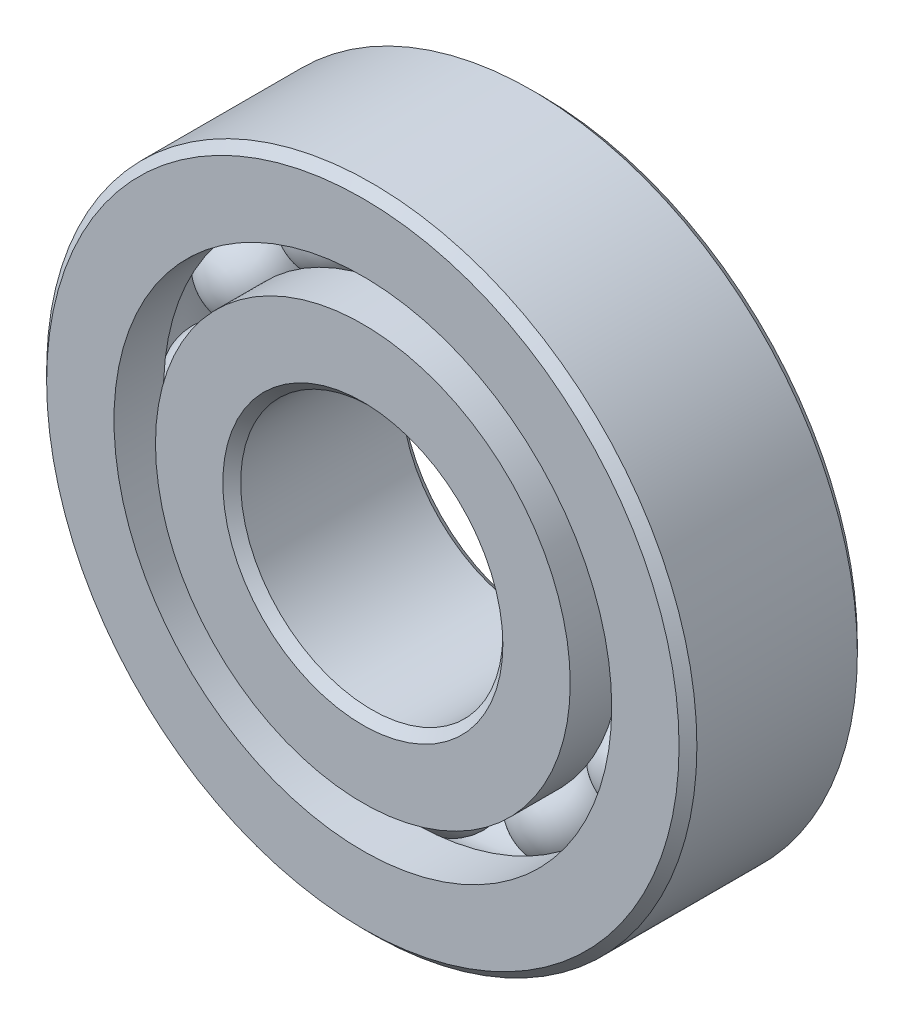
ISO-10303-21;
HEADER;
FILE_DESCRIPTION(('STEP AP214'),'2;1');
FILE_NAME('part.step','',(''),(''),'','','');
FILE_SCHEMA(('AUTOMOTIVE_DESIGN { 1 0 10303 214 1 1 1 1 }'));
ENDSEC;
DATA;
#1=APPLICATION_CONTEXT('core data for automotive mechanical design processes');
#2=APPLICATION_PROTOCOL_DEFINITION('international standard','automotive_design',2000,#1);
#3=PRODUCT_CONTEXT('',#1,'mechanical');
#4=PRODUCT('Part','Part','',(#3));
#5=PRODUCT_RELATED_PRODUCT_CATEGORY('part','',(#4));
#6=PRODUCT_DEFINITION_FORMATION('','',#4);
#7=PRODUCT_DEFINITION_CONTEXT('part definition',#1,'design');
#8=PRODUCT_DEFINITION('design','',#6,#7);
#9=PRODUCT_DEFINITION_SHAPE('','',#8);
#10=(LENGTH_UNIT() NAMED_UNIT(*) SI_UNIT(.MILLI.,.METRE.));
#11=(NAMED_UNIT(*) PLANE_ANGLE_UNIT() SI_UNIT($,.RADIAN.));
#12=(NAMED_UNIT(*) SI_UNIT($,.STERADIAN.) SOLID_ANGLE_UNIT());
#13=UNCERTAINTY_MEASURE_WITH_UNIT(LENGTH_MEASURE(1.E-05),#10,'distance_accuracy_value','');
#14=(GEOMETRIC_REPRESENTATION_CONTEXT(3) GLOBAL_UNCERTAINTY_ASSIGNED_CONTEXT((#13)) GLOBAL_UNIT_ASSIGNED_CONTEXT((#10,
#11,#12)) REPRESENTATION_CONTEXT('',''));
#15=CARTESIAN_POINT('',(0.,0.,0.));
#16=DIRECTION('',(0.,0.,1.));
#17=DIRECTION('',(1.,0.,0.));
#18=AXIS2_PLACEMENT_3D('',#15,#16,#17);
#19=CARTESIAN_POINT('',(-10.8749999999998,18.8360525323117,0.));
#20=DIRECTION('',(0.,0.,1.));
#21=DIRECTION('',(-0.499999999999989,0.866025403784445,0.));
#22=AXIS2_PLACEMENT_3D('',#19,#20,#21);
#23=SPHERICAL_SURFACE('',#22,4.26429078321467);
#24=CARTESIAN_POINT('',(-10.8749999999998,18.8360525323117,4.26429078321467));
#25=VERTEX_POINT('',#24);
#26=VERTEX_LOOP('',#25);
#27=FACE_BOUND('',#26,.T.);
#28=ADVANCED_FACE('F43',(#27),#23,.T.);
#29=CLOSED_SHELL('',(#28));
#30=MANIFOLD_SOLID_BREP('B2',#29);
#31=CARTESIAN_POINT('',(-18.8360525323114,10.8750000000002,0.));
#32=DIRECTION('',(0.,0.,1.));
#33=DIRECTION('',(-0.866025403784433,0.50000000000001,0.));
#34=AXIS2_PLACEMENT_3D('',#31,#32,#33);
#35=SPHERICAL_SURFACE('',#34,4.26429078321467);
#36=CARTESIAN_POINT('',(-18.8360525323114,10.8750000000002,4.26429078321467));
#37=VERTEX_POINT('',#36);
#38=VERTEX_LOOP('',#37);
#39=FACE_BOUND('',#38,.T.);
#40=ADVANCED_FACE('F63',(#39),#35,.T.);
#41=CLOSED_SHELL('',(#40));
#42=MANIFOLD_SOLID_BREP('B6',#41);
#43=CARTESIAN_POINT('',(-21.75,2.27819157359514E-13,0.));
#44=DIRECTION('',(0.,0.,1.));
#45=DIRECTION('',(-1.,0.,0.));
#46=AXIS2_PLACEMENT_3D('',#43,#44,#45);
#47=SPHERICAL_SURFACE('',#46,4.26429078321467);
#48=CARTESIAN_POINT('',(-21.75,2.27819157359514E-13,4.26429078321467));
#49=VERTEX_POINT('',#48);
#50=VERTEX_LOOP('',#49);
#51=FACE_BOUND('',#50,.T.);
#52=ADVANCED_FACE('F83',(#51),#47,.T.);
#53=CLOSED_SHELL('',(#52));
#54=MANIFOLD_SOLID_BREP('B39',#53);
#55=CARTESIAN_POINT('',(-18.8360525323116,-10.8749999999998,0.));
#56=DIRECTION('',(0.,0.,1.));
#57=DIRECTION('',(-0.866025403784443,-0.499999999999992,0.));
#58=AXIS2_PLACEMENT_3D('',#55,#56,#57);
#59=SPHERICAL_SURFACE('',#58,4.26429078321467);
#60=CARTESIAN_POINT('',(-18.8360525323116,-10.8749999999998,4.26429078321467));
#61=VERTEX_POINT('',#60);
#62=VERTEX_LOOP('',#61);
#63=FACE_BOUND('',#62,.T.);
#64=ADVANCED_FACE('F103',(#63),#59,.T.);
#65=CLOSED_SHELL('',(#64));
#66=MANIFOLD_SOLID_BREP('B59',#65);
#67=CARTESIAN_POINT('',(-10.8750000000002,-18.8360525323115,0.));
#68=DIRECTION('',(0.,0.,1.));
#69=DIRECTION('',(-0.500000000000007,-0.866025403784435,0.));
#70=AXIS2_PLACEMENT_3D('',#67,#68,#69);
#71=SPHERICAL_SURFACE('',#70,4.26429078321467);
#72=CARTESIAN_POINT('',(-10.8750000000002,-18.8360525323115,4.26429078321467));
#73=VERTEX_POINT('',#72);
#74=VERTEX_LOOP('',#73);
#75=FACE_BOUND('',#74,.T.);
#76=ADVANCED_FACE('F123',(#75),#71,.T.);
#77=CLOSED_SHELL('',(#76));
#78=MANIFOLD_SOLID_BREP('B79',#77);
#79=CARTESIAN_POINT('',(-1.51879438239676E-13,-21.75,0.));
#80=DIRECTION('',(0.,0.,1.));
#81=DIRECTION('',(0.,-1.,0.));
#82=AXIS2_PLACEMENT_3D('',#79,#80,#81);
#83=SPHERICAL_SURFACE('',#82,4.26429078321467);
#84=CARTESIAN_POINT('',(-1.51879438239676E-13,-21.75,4.26429078321467));
#85=VERTEX_POINT('',#84);
#86=VERTEX_LOOP('',#85);
#87=FACE_BOUND('',#86,.T.);
#88=ADVANCED_FACE('F143',(#87),#83,.T.);
#89=CLOSED_SHELL('',(#88));
#90=MANIFOLD_SOLID_BREP('B99',#89);
#91=CARTESIAN_POINT('',(10.8749999999999,-18.8360525323116,0.));
#92=DIRECTION('',(0.,0.,1.));
#93=DIRECTION('',(0.499999999999995,-0.866025403784442,0.));
#94=AXIS2_PLACEMENT_3D('',#91,#92,#93);
#95=SPHERICAL_SURFACE('',#94,4.26429078321467);
#96=CARTESIAN_POINT('',(10.8749999999999,-18.8360525323116,4.26429078321467));
#97=VERTEX_POINT('',#96);
#98=VERTEX_LOOP('',#97);
#99=FACE_BOUND('',#98,.T.);
#100=ADVANCED_FACE('F163',(#99),#95,.T.);
#101=CLOSED_SHELL('',(#100));
#102=MANIFOLD_SOLID_BREP('B119',#101);
#103=CARTESIAN_POINT('',(18.8360525323115,-10.8750000000001,0.));
#104=DIRECTION('',(0.,0.,1.));
#105=DIRECTION('',(0.866025403784436,-0.500000000000004,0.));
#106=AXIS2_PLACEMENT_3D('',#103,#104,#105);
#107=SPHERICAL_SURFACE('',#106,4.26429078321467);
#108=CARTESIAN_POINT('',(18.8360525323115,-10.8750000000001,4.26429078321467));
#109=VERTEX_POINT('',#108);
#110=VERTEX_LOOP('',#109);
#111=FACE_BOUND('',#110,.T.);
#112=ADVANCED_FACE('F183',(#111),#107,.T.);
#113=CLOSED_SHELL('',(#112));
#114=MANIFOLD_SOLID_BREP('B139',#113);
#115=CARTESIAN_POINT('',(21.75,0.,0.));
#116=DIRECTION('',(0.,0.,1.));
#117=DIRECTION('',(1.,0.,0.));
#118=AXIS2_PLACEMENT_3D('',#115,#116,#117);
#119=SPHERICAL_SURFACE('',#118,4.26429078321467);
#120=CARTESIAN_POINT('',(21.75,0.,4.26429078321467));
#121=VERTEX_POINT('',#120);
#122=VERTEX_LOOP('',#121);
#123=FACE_BOUND('',#122,.T.);
#124=ADVANCED_FACE('F203',(#123),#119,.T.);
#125=CLOSED_SHELL('',(#124));
#126=MANIFOLD_SOLID_BREP('B159',#125);
#127=CARTESIAN_POINT('',(18.8360525323116,10.875,0.));
#128=DIRECTION('',(0.,0.,1.));
#129=DIRECTION('',(0.86602540378444,0.499999999999998,0.));
#130=AXIS2_PLACEMENT_3D('',#127,#128,#129);
#131=SPHERICAL_SURFACE('',#130,4.26429078321467);
#132=CARTESIAN_POINT('',(18.8360525323116,10.875,4.26429078321467));
#133=VERTEX_POINT('',#132);
#134=VERTEX_LOOP('',#133);
#135=FACE_BOUND('',#134,.T.);
#136=ADVANCED_FACE('F223',(#135),#131,.T.);
#137=CLOSED_SHELL('',(#136));
#138=MANIFOLD_SOLID_BREP('B179',#137);
#139=CARTESIAN_POINT('',(10.875,18.8360525323115,0.));
#140=DIRECTION('',(0.,0.,1.));
#141=DIRECTION('',(0.500000000000001,0.866025403784438,0.));
#142=AXIS2_PLACEMENT_3D('',#139,#140,#141);
#143=SPHERICAL_SURFACE('',#142,4.26429078321467);
#144=CARTESIAN_POINT('',(10.875,18.8360525323115,4.26429078321467));
#145=VERTEX_POINT('',#144);
#146=VERTEX_LOOP('',#145);
#147=FACE_BOUND('',#146,.T.);
#148=ADVANCED_FACE('F243',(#147),#143,.T.);
#149=CLOSED_SHELL('',(#148));
#150=MANIFOLD_SOLID_BREP('B199',#149);
#151=CARTESIAN_POINT('',(0.,21.75,0.));
#152=DIRECTION('',(0.,0.,1.));
#153=DIRECTION('',(0.,1.,0.));
#154=AXIS2_PLACEMENT_3D('',#151,#152,#153);
#155=SPHERICAL_SURFACE('',#154,4.26429078321467);
#156=CARTESIAN_POINT('',(0.,21.75,4.26429078321467));
#157=VERTEX_POINT('',#156);
#158=VERTEX_LOOP('',#157);
#159=FACE_BOUND('',#158,.T.);
#160=ADVANCED_FACE('F265',(#159),#155,.T.);
#161=CLOSED_SHELL('',(#160));
#162=MANIFOLD_SOLID_BREP('B219',#161);
#163=CARTESIAN_POINT('',(0.,19.771978021978,8.5));
#164=DIRECTION('',(0.,0.,-1.));
#165=DIRECTION('',(-1.,0.,0.));
#166=AXIS2_PLACEMENT_3D('',#163,#164,#165);
#167=PLANE('',#166);
#168=CARTESIAN_POINT('',(0.,0.,8.5));
#169=DIRECTION('',(0.,0.,1.));
#170=DIRECTION('',(1.,0.,0.));
#171=AXIS2_PLACEMENT_3D('',#168,#169,#170);
#172=CIRCLE('',#171,13.35);
#173=CARTESIAN_POINT('',(13.35,0.,8.5));
#174=VERTEX_POINT('',#173);
#175=EDGE_CURVE('E314',#174,#174,#172,.T.);
#176=ORIENTED_EDGE('',*,*,#175,.F.);
#177=EDGE_LOOP('',(#176));
#178=FACE_BOUND('',#177,.T.);
#179=CARTESIAN_POINT('',(0.,0.,8.5));
#180=DIRECTION('',(0.,0.,1.));
#181=DIRECTION('',(1.,0.,0.));
#182=AXIS2_PLACEMENT_3D('',#179,#180,#181);
#183=CIRCLE('',#182,19.771978021978);
#184=CARTESIAN_POINT('',(19.771978021978,0.,8.5));
#185=VERTEX_POINT('',#184);
#186=EDGE_CURVE('E264',#185,#185,#183,.T.);
#187=ORIENTED_EDGE('',*,*,#186,.T.);
#188=EDGE_LOOP('',(#187));
#189=FACE_BOUND('',#188,.T.);
#190=ADVANCED_FACE('F286',(#178,#189),#167,.F.);
#191=CARTESIAN_POINT('',(0.,0.,8.5));
#192=DIRECTION('',(0.,0.,1.));
#193=DIRECTION('',(1.,0.,0.));
#194=AXIS2_PLACEMENT_3D('',#191,#192,#193);
#195=CYLINDRICAL_SURFACE('',#194,19.771978021978);
#196=ORIENTED_EDGE('',*,*,#186,.F.);
#197=EDGE_LOOP('',(#196));
#198=FACE_BOUND('',#197,.T.);
#199=CARTESIAN_POINT('',(0.,0.,3.77777777777778));
#200=DIRECTION('',(0.,0.,1.));
#201=DIRECTION('',(1.,0.,0.));
#202=AXIS2_PLACEMENT_3D('',#199,#200,#201);
#203=CIRCLE('',#202,19.771978021978);
#204=CARTESIAN_POINT('',(19.771978021978,0.,3.77777777777778));
#205=VERTEX_POINT('',#204);
#206=EDGE_CURVE('E292',#205,#205,#203,.T.);
#207=ORIENTED_EDGE('',*,*,#206,.T.);
#208=EDGE_LOOP('',(#207));
#209=FACE_BOUND('',#208,.T.);
#210=ADVANCED_FACE('F321',(#198,#209),#195,.T.);
#211=CARTESIAN_POINT('',(0.,0.,0.));
#212=DIRECTION('',(0.,0.,1.));
#213=DIRECTION('',(1.,0.,0.));
#214=AXIS2_PLACEMENT_3D('',#211,#212,#213);
#215=TOROIDAL_SURFACE('',#214,21.75,4.26429078321466);
#216=ORIENTED_EDGE('',*,*,#206,.F.);
#217=EDGE_LOOP('',(#216));
#218=FACE_BOUND('',#217,.T.);
#219=CARTESIAN_POINT('',(0.,0.,-3.77777777777778));
#220=DIRECTION('',(0.,0.,1.));
#221=DIRECTION('',(1.,0.,0.));
#222=AXIS2_PLACEMENT_3D('',#219,#220,#221);
#223=CIRCLE('',#222,19.771978021978);
#224=CARTESIAN_POINT('',(19.771978021978,0.,-3.77777777777778));
#225=VERTEX_POINT('',#224);
#226=EDGE_CURVE('E296',#225,#225,#223,.T.);
#227=ORIENTED_EDGE('',*,*,#226,.T.);
#228=EDGE_LOOP('',(#227));
#229=FACE_BOUND('',#228,.T.);
#230=ADVANCED_FACE('F325',(#218,#229),#215,.F.);
#231=CARTESIAN_POINT('',(0.,0.,8.5));
#232=DIRECTION('',(0.,0.,1.));
#233=DIRECTION('',(1.,0.,0.));
#234=AXIS2_PLACEMENT_3D('',#231,#232,#233);
#235=CYLINDRICAL_SURFACE('',#234,19.771978021978);
#236=ORIENTED_EDGE('',*,*,#226,.F.);
#237=EDGE_LOOP('',(#236));
#238=FACE_BOUND('',#237,.T.);
#239=CARTESIAN_POINT('',(0.,0.,-8.5));
#240=DIRECTION('',(0.,0.,1.));
#241=DIRECTION('',(1.,0.,0.));
#242=AXIS2_PLACEMENT_3D('',#239,#240,#241);
#243=CIRCLE('',#242,19.771978021978);
#244=CARTESIAN_POINT('',(19.771978021978,0.,-8.5));
#245=VERTEX_POINT('',#244);
#246=EDGE_CURVE('E300',#245,#245,#243,.T.);
#247=ORIENTED_EDGE('',*,*,#246,.T.);
#248=EDGE_LOOP('',(#247));
#249=FACE_BOUND('',#248,.T.);
#250=ADVANCED_FACE('F330',(#238,#249),#235,.T.);
#251=CARTESIAN_POINT('',(0.,13.35,-8.5));
#252=DIRECTION('',(0.,0.,1.));
#253=DIRECTION('',(1.,0.,0.));
#254=AXIS2_PLACEMENT_3D('',#251,#252,#253);
#255=PLANE('',#254);
#256=ORIENTED_EDGE('',*,*,#246,.F.);
#257=EDGE_LOOP('',(#256));
#258=FACE_BOUND('',#257,.T.);
#259=CARTESIAN_POINT('',(0.,0.,-8.50000000000001));
#260=DIRECTION('',(0.,0.,1.));
#261=DIRECTION('',(1.,0.,0.));
#262=AXIS2_PLACEMENT_3D('',#259,#260,#261);
#263=CIRCLE('',#262,13.35);
#264=CARTESIAN_POINT('',(13.35,0.,-8.50000000000001));
#265=VERTEX_POINT('',#264);
#266=EDGE_CURVE('E305',#265,#265,#263,.T.);
#267=ORIENTED_EDGE('',*,*,#266,.T.);
#268=EDGE_LOOP('',(#267));
#269=FACE_BOUND('',#268,.T.);
#270=ADVANCED_FACE('F336',(#258,#269),#255,.F.);
#271=CARTESIAN_POINT('',(0.,0.,-7.65));
#272=DIRECTION('',(0.,0.,-1.));
#273=DIRECTION('',(-1.,0.,0.));
#274=AXIS2_PLACEMENT_3D('',#271,#272,#273);
#275=CONICAL_SURFACE('',#274,12.5,0.785398163397445);
#276=ORIENTED_EDGE('',*,*,#266,.F.);
#277=EDGE_LOOP('',(#276));
#278=FACE_BOUND('',#277,.T.);
#279=CARTESIAN_POINT('',(0.,0.,-7.65));
#280=DIRECTION('',(0.,0.,1.));
#281=DIRECTION('',(1.,0.,0.));
#282=AXIS2_PLACEMENT_3D('',#279,#280,#281);
#283=CIRCLE('',#282,12.5);
#284=CARTESIAN_POINT('',(12.5,0.,-7.65));
#285=VERTEX_POINT('',#284);
#286=EDGE_CURVE('E308',#285,#285,#283,.T.);
#287=ORIENTED_EDGE('',*,*,#286,.T.);
#288=EDGE_LOOP('',(#287));
#289=FACE_BOUND('',#288,.T.);
#290=ADVANCED_FACE('F340',(#278,#289),#275,.F.);
#291=CARTESIAN_POINT('',(0.,0.,8.5));
#292=DIRECTION('',(0.,0.,1.));
#293=DIRECTION('',(1.,0.,0.));
#294=AXIS2_PLACEMENT_3D('',#291,#292,#293);
#295=CYLINDRICAL_SURFACE('',#294,12.5);
#296=ORIENTED_EDGE('',*,*,#286,.F.);
#297=EDGE_LOOP('',(#296));
#298=FACE_BOUND('',#297,.T.);
#299=CARTESIAN_POINT('',(0.,0.,7.65));
#300=DIRECTION('',(0.,0.,1.));
#301=DIRECTION('',(1.,0.,0.));
#302=AXIS2_PLACEMENT_3D('',#299,#300,#301);
#303=CIRCLE('',#302,12.5);
#304=CARTESIAN_POINT('',(12.5,0.,7.65));
#305=VERTEX_POINT('',#304);
#306=EDGE_CURVE('E311',#305,#305,#303,.T.);
#307=ORIENTED_EDGE('',*,*,#306,.T.);
#308=EDGE_LOOP('',(#307));
#309=FACE_BOUND('',#308,.T.);
#310=ADVANCED_FACE('F344',(#298,#309),#295,.F.);
#311=CARTESIAN_POINT('',(0.,0.,8.5));
#312=DIRECTION('',(0.,0.,1.));
#313=DIRECTION('',(1.,0.,0.));
#314=AXIS2_PLACEMENT_3D('',#311,#312,#313);
#315=CONICAL_SURFACE('',#314,13.35,0.785398163397451);
#316=ORIENTED_EDGE('',*,*,#306,.F.);
#317=EDGE_LOOP('',(#316));
#318=FACE_BOUND('',#317,.T.);
#319=ORIENTED_EDGE('',*,*,#175,.T.);
#320=EDGE_LOOP('',(#319));
#321=FACE_BOUND('',#320,.T.);
#322=ADVANCED_FACE('F318',(#318,#321),#315,.F.);
#323=CLOSED_SHELL('',(#190,#210,#230,#250,#270,#290,#310,#322));
#324=MANIFOLD_SOLID_BREP('B239',#323);
#325=CARTESIAN_POINT('',(0.,0.,7.65));
#326=DIRECTION('',(0.,0.,-1.));
#327=DIRECTION('',(-1.,0.,0.));
#328=AXIS2_PLACEMENT_3D('',#325,#326,#327);
#329=CONICAL_SURFACE('',#328,31.,0.785398163397448);
#330=CARTESIAN_POINT('',(0.,0.,8.5));
#331=DIRECTION('',(0.,0.,1.));
#332=DIRECTION('',(1.,0.,0.));
#333=AXIS2_PLACEMENT_3D('',#330,#331,#332);
#334=CIRCLE('',#333,30.15);
#335=CARTESIAN_POINT('',(30.15,0.,8.5));
#336=VERTEX_POINT('',#335);
#337=EDGE_CURVE('E441',#336,#336,#334,.T.);
#338=ORIENTED_EDGE('',*,*,#337,.F.);
#339=EDGE_LOOP('',(#338));
#340=FACE_BOUND('',#339,.T.);
#341=CARTESIAN_POINT('',(0.,0.,7.65));
#342=DIRECTION('',(0.,0.,1.));
#343=DIRECTION('',(1.,0.,0.));
#344=AXIS2_PLACEMENT_3D('',#341,#342,#343);
#345=CIRCLE('',#344,31.);
#346=CARTESIAN_POINT('',(31.,0.,7.65));
#347=VERTEX_POINT('',#346);
#348=EDGE_CURVE('E285',#347,#347,#345,.T.);
#349=ORIENTED_EDGE('',*,*,#348,.T.);
#350=EDGE_LOOP('',(#349));
#351=FACE_BOUND('',#350,.T.);
#352=ADVANCED_FACE('F413',(#340,#351),#329,.T.);
#353=CARTESIAN_POINT('',(0.,0.,8.5));
#354=DIRECTION('',(0.,0.,1.));
#355=DIRECTION('',(1.,0.,0.));
#356=AXIS2_PLACEMENT_3D('',#353,#354,#355);
#357=CYLINDRICAL_SURFACE('',#356,31.);
#358=ORIENTED_EDGE('',*,*,#348,.F.);
#359=EDGE_LOOP('',(#358));
#360=FACE_BOUND('',#359,.T.);
#361=CARTESIAN_POINT('',(0.,0.,-7.65));
#362=DIRECTION('',(0.,0.,1.));
#363=DIRECTION('',(1.,0.,0.));
#364=AXIS2_PLACEMENT_3D('',#361,#362,#363);
#365=CIRCLE('',#364,31.);
#366=CARTESIAN_POINT('',(31.,0.,-7.65));
#367=VERTEX_POINT('',#366);
#368=EDGE_CURVE('E419',#367,#367,#365,.T.);
#369=ORIENTED_EDGE('',*,*,#368,.T.);
#370=EDGE_LOOP('',(#369));
#371=FACE_BOUND('',#370,.T.);
#372=ADVANCED_FACE('F448',(#360,#371),#357,.T.);
#373=CARTESIAN_POINT('',(0.,0.,-8.5));
#374=DIRECTION('',(0.,0.,1.));
#375=DIRECTION('',(1.,0.,0.));
#376=AXIS2_PLACEMENT_3D('',#373,#374,#375);
#377=CONICAL_SURFACE('',#376,30.15,0.785398163397448);
#378=ORIENTED_EDGE('',*,*,#368,.F.);
#379=EDGE_LOOP('',(#378));
#380=FACE_BOUND('',#379,.T.);
#381=CARTESIAN_POINT('',(0.,0.,-8.5));
#382=DIRECTION('',(0.,0.,1.));
#383=DIRECTION('',(1.,0.,0.));
#384=AXIS2_PLACEMENT_3D('',#381,#382,#383);
#385=CIRCLE('',#384,30.15);
#386=CARTESIAN_POINT('',(30.15,0.,-8.5));
#387=VERTEX_POINT('',#386);
#388=EDGE_CURVE('E423',#387,#387,#385,.T.);
#389=ORIENTED_EDGE('',*,*,#388,.T.);
#390=EDGE_LOOP('',(#389));
#391=FACE_BOUND('',#390,.T.);
#392=ADVANCED_FACE('F452',(#380,#391),#377,.T.);
#393=CARTESIAN_POINT('',(0.,30.15,-8.5));
#394=DIRECTION('',(0.,0.,1.));
#395=DIRECTION('',(1.,0.,0.));
#396=AXIS2_PLACEMENT_3D('',#393,#394,#395);
#397=PLANE('',#396);
#398=ORIENTED_EDGE('',*,*,#388,.F.);
#399=EDGE_LOOP('',(#398));
#400=FACE_BOUND('',#399,.T.);
#401=CARTESIAN_POINT('',(0.,0.,-8.5));
#402=DIRECTION('',(0.,0.,1.));
#403=DIRECTION('',(1.,0.,0.));
#404=AXIS2_PLACEMENT_3D('',#401,#402,#403);
#405=CIRCLE('',#404,23.728021978022);
#406=CARTESIAN_POINT('',(23.728021978022,0.,-8.5));
#407=VERTEX_POINT('',#406);
#408=EDGE_CURVE('E427',#407,#407,#405,.T.);
#409=ORIENTED_EDGE('',*,*,#408,.T.);
#410=EDGE_LOOP('',(#409));
#411=FACE_BOUND('',#410,.T.);
#412=ADVANCED_FACE('F457',(#400,#411),#397,.F.);
#413=CARTESIAN_POINT('',(0.,0.,8.5));
#414=DIRECTION('',(0.,0.,1.));
#415=DIRECTION('',(1.,0.,0.));
#416=AXIS2_PLACEMENT_3D('',#413,#414,#415);
#417=CYLINDRICAL_SURFACE('',#416,23.728021978022);
#418=ORIENTED_EDGE('',*,*,#408,.F.);
#419=EDGE_LOOP('',(#418));
#420=FACE_BOUND('',#419,.T.);
#421=CARTESIAN_POINT('',(0.,0.,-3.77777777777778));
#422=DIRECTION('',(0.,0.,1.));
#423=DIRECTION('',(1.,0.,0.));
#424=AXIS2_PLACEMENT_3D('',#421,#422,#423);
#425=CIRCLE('',#424,23.728021978022);
#426=CARTESIAN_POINT('',(23.728021978022,0.,-3.77777777777778));
#427=VERTEX_POINT('',#426);
#428=EDGE_CURVE('E432',#427,#427,#425,.T.);
#429=ORIENTED_EDGE('',*,*,#428,.T.);
#430=EDGE_LOOP('',(#429));
#431=FACE_BOUND('',#430,.T.);
#432=ADVANCED_FACE('F463',(#420,#431),#417,.F.);
#433=CARTESIAN_POINT('',(0.,0.,0.));
#434=DIRECTION('',(0.,0.,1.));
#435=DIRECTION('',(1.,0.,0.));
#436=AXIS2_PLACEMENT_3D('',#433,#434,#435);
#437=TOROIDAL_SURFACE('',#436,21.75,4.26429078321467);
#438=ORIENTED_EDGE('',*,*,#428,.F.);
#439=EDGE_LOOP('',(#438));
#440=FACE_BOUND('',#439,.T.);
#441=CARTESIAN_POINT('',(0.,0.,3.77777777777778));
#442=DIRECTION('',(0.,0.,1.));
#443=DIRECTION('',(1.,0.,0.));
#444=AXIS2_PLACEMENT_3D('',#441,#442,#443);
#445=CIRCLE('',#444,23.728021978022);
#446=CARTESIAN_POINT('',(23.728021978022,0.,3.77777777777778));
#447=VERTEX_POINT('',#446);
#448=EDGE_CURVE('E435',#447,#447,#445,.T.);
#449=ORIENTED_EDGE('',*,*,#448,.T.);
#450=EDGE_LOOP('',(#449));
#451=FACE_BOUND('',#450,.T.);
#452=ADVANCED_FACE('F467',(#440,#451),#437,.F.);
#453=CARTESIAN_POINT('',(0.,0.,8.5));
#454=DIRECTION('',(0.,0.,1.));
#455=DIRECTION('',(1.,0.,0.));
#456=AXIS2_PLACEMENT_3D('',#453,#454,#455);
#457=CYLINDRICAL_SURFACE('',#456,23.728021978022);
#458=ORIENTED_EDGE('',*,*,#448,.F.);
#459=EDGE_LOOP('',(#458));
#460=FACE_BOUND('',#459,.T.);
#461=CARTESIAN_POINT('',(0.,0.,8.5));
#462=DIRECTION('',(0.,0.,1.));
#463=DIRECTION('',(1.,0.,0.));
#464=AXIS2_PLACEMENT_3D('',#461,#462,#463);
#465=CIRCLE('',#464,23.728021978022);
#466=CARTESIAN_POINT('',(23.728021978022,0.,8.5));
#467=VERTEX_POINT('',#466);
#468=EDGE_CURVE('E438',#467,#467,#465,.T.);
#469=ORIENTED_EDGE('',*,*,#468,.T.);
#470=EDGE_LOOP('',(#469));
#471=FACE_BOUND('',#470,.T.);
#472=ADVANCED_FACE('F471',(#460,#471),#457,.F.);
#473=CARTESIAN_POINT('',(0.,30.15,8.5));
#474=DIRECTION('',(0.,0.,-1.));
#475=DIRECTION('',(-1.,0.,0.));
#476=AXIS2_PLACEMENT_3D('',#473,#474,#475);
#477=PLANE('',#476);
#478=ORIENTED_EDGE('',*,*,#468,.F.);
#479=EDGE_LOOP('',(#478));
#480=FACE_BOUND('',#479,.T.);
#481=ORIENTED_EDGE('',*,*,#337,.T.);
#482=EDGE_LOOP('',(#481));
#483=FACE_BOUND('',#482,.T.);
#484=ADVANCED_FACE('F445',(#480,#483),#477,.F.);
#485=CLOSED_SHELL('',(#352,#372,#392,#412,#432,#452,#472,#484));
#486=MANIFOLD_SOLID_BREP('B259',#485);
#487=ADVANCED_BREP_SHAPE_REPRESENTATION('',(#18,#30,#42,#54,#66,#78,#90,#102,#114,#126,#138,
#150,#162,#324,#486),#14);
#488=SHAPE_DEFINITION_REPRESENTATION(#9,#487);
ENDSEC;
END-ISO-10303-21;
